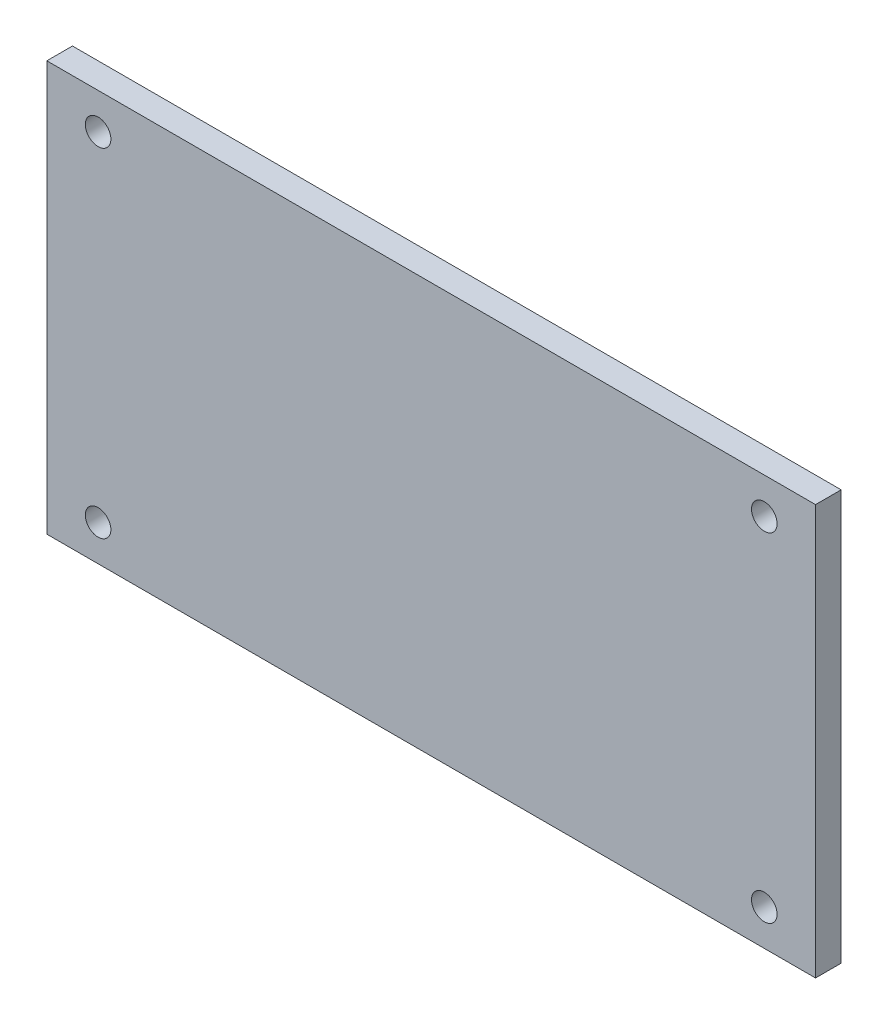
ISO-10303-21;
HEADER;
FILE_DESCRIPTION(('STEP AP214'),'2;1');
FILE_NAME('part.step','',(''),(''),'','','');
FILE_SCHEMA(('AUTOMOTIVE_DESIGN { 1 0 10303 214 1 1 1 1 }'));
ENDSEC;
DATA;
#1=APPLICATION_CONTEXT('core data for automotive mechanical design processes');
#2=APPLICATION_PROTOCOL_DEFINITION('international standard','automotive_design',2000,#1);
#3=PRODUCT_CONTEXT('',#1,'mechanical');
#4=PRODUCT('Part','Part','',(#3));
#5=PRODUCT_RELATED_PRODUCT_CATEGORY('part','',(#4));
#6=PRODUCT_DEFINITION_FORMATION('','',#4);
#7=PRODUCT_DEFINITION_CONTEXT('part definition',#1,'design');
#8=PRODUCT_DEFINITION('design','',#6,#7);
#9=PRODUCT_DEFINITION_SHAPE('','',#8);
#10=(LENGTH_UNIT() NAMED_UNIT(*) SI_UNIT(.MILLI.,.METRE.));
#11=(NAMED_UNIT(*) PLANE_ANGLE_UNIT() SI_UNIT($,.RADIAN.));
#12=(NAMED_UNIT(*) SI_UNIT($,.STERADIAN.) SOLID_ANGLE_UNIT());
#13=UNCERTAINTY_MEASURE_WITH_UNIT(LENGTH_MEASURE(1.E-05),#10,'distance_accuracy_value','');
#14=(GEOMETRIC_REPRESENTATION_CONTEXT(3) GLOBAL_UNCERTAINTY_ASSIGNED_CONTEXT((#13)) GLOBAL_UNIT_ASSIGNED_CONTEXT((#10,
#11,#12)) REPRESENTATION_CONTEXT('',''));
#15=CARTESIAN_POINT('',(0.,0.,0.));
#16=DIRECTION('',(0.,0.,1.));
#17=DIRECTION('',(1.,0.,0.));
#18=AXIS2_PLACEMENT_3D('',#15,#16,#17);
#19=CARTESIAN_POINT('',(0.,0.,5.));
#20=DIRECTION('',(0.,0.,1.));
#21=DIRECTION('',(1.,0.,0.));
#22=AXIS2_PLACEMENT_3D('',#19,#20,#21);
#23=PLANE('',#22);
#24=CARTESIAN_POINT('',(65.,-23.,5.));
#25=DIRECTION('',(0.,0.,1.));
#26=DIRECTION('',(1.,0.,0.));
#27=AXIS2_PLACEMENT_3D('',#24,#25,#26);
#28=CIRCLE('',#27,2.5);
#29=CARTESIAN_POINT('',(67.5,-23.,5.));
#30=VERTEX_POINT('',#29);
#31=EDGE_CURVE('E123',#30,#30,#28,.T.);
#32=ORIENTED_EDGE('',*,*,#31,.F.);
#33=EDGE_LOOP('',(#32));
#34=FACE_BOUND('',#33,.T.);
#35=CARTESIAN_POINT('',(-65.,43.,5.));
#36=DIRECTION('',(0.,0.,1.));
#37=DIRECTION('',(1.,0.,0.));
#38=AXIS2_PLACEMENT_3D('',#35,#36,#37);
#39=CIRCLE('',#38,2.50000000000001);
#40=CARTESIAN_POINT('',(-62.5,43.,5.));
#41=VERTEX_POINT('',#40);
#42=EDGE_CURVE('E102',#41,#41,#39,.T.);
#43=ORIENTED_EDGE('',*,*,#42,.F.);
#44=EDGE_LOOP('',(#43));
#45=FACE_BOUND('',#44,.T.);
#46=DIRECTION('',(0.,1.,0.));
#47=VECTOR('',#46,1.);
#48=CARTESIAN_POINT('',(75.,50.,5.));
#49=LINE('',#48,#47);
#50=CARTESIAN_POINT('',(75.,-30.,5.));
#51=VERTEX_POINT('',#50);
#52=CARTESIAN_POINT('',(75.,50.,5.));
#53=VERTEX_POINT('',#52);
#54=EDGE_CURVE('E87',#51,#53,#49,.T.);
#55=ORIENTED_EDGE('',*,*,#54,.T.);
#56=DIRECTION('',(-1.,0.,0.));
#57=VECTOR('',#56,1.);
#58=CARTESIAN_POINT('',(-75.,50.,5.));
#59=LINE('',#58,#57);
#60=CARTESIAN_POINT('',(-75.,50.,5.));
#61=VERTEX_POINT('',#60);
#62=EDGE_CURVE('E82',#53,#61,#59,.T.);
#63=ORIENTED_EDGE('',*,*,#62,.T.);
#64=DIRECTION('',(0.,-1.,0.));
#65=VECTOR('',#64,1.);
#66=CARTESIAN_POINT('',(-75.,50.,5.));
#67=LINE('',#66,#65);
#68=CARTESIAN_POINT('',(-75.,-30.,5.));
#69=VERTEX_POINT('',#68);
#70=EDGE_CURVE('E85',#61,#69,#67,.T.);
#71=ORIENTED_EDGE('',*,*,#70,.T.);
#72=DIRECTION('',(1.,0.,0.));
#73=VECTOR('',#72,1.);
#74=CARTESIAN_POINT('',(-75.,-30.,5.));
#75=LINE('',#74,#73);
#76=EDGE_CURVE('E52',#69,#51,#75,.T.);
#77=ORIENTED_EDGE('',*,*,#76,.T.);
#78=EDGE_LOOP('',(#55,#63,#71,#77));
#79=FACE_BOUND('',#78,.T.);
#80=CARTESIAN_POINT('',(65.,43.,5.));
#81=DIRECTION('',(0.,0.,1.));
#82=DIRECTION('',(-1.,0.,0.));
#83=AXIS2_PLACEMENT_3D('',#80,#81,#82);
#84=CIRCLE('',#83,2.50000000000001);
#85=CARTESIAN_POINT('',(62.5,43.,5.));
#86=VERTEX_POINT('',#85);
#87=EDGE_CURVE('E117',#86,#86,#84,.T.);
#88=ORIENTED_EDGE('',*,*,#87,.F.);
#89=EDGE_LOOP('',(#88));
#90=FACE_BOUND('',#89,.T.);
#91=CARTESIAN_POINT('',(-65.,-23.,5.));
#92=DIRECTION('',(0.,0.,1.));
#93=DIRECTION('',(-1.,0.,0.));
#94=AXIS2_PLACEMENT_3D('',#91,#92,#93);
#95=CIRCLE('',#94,2.5);
#96=CARTESIAN_POINT('',(-67.5,-23.,5.));
#97=VERTEX_POINT('',#96);
#98=EDGE_CURVE('E129',#97,#97,#95,.T.);
#99=ORIENTED_EDGE('',*,*,#98,.F.);
#100=EDGE_LOOP('',(#99));
#101=FACE_BOUND('',#100,.T.);
#102=ADVANCED_FACE('F35',(#34,#45,#79,#90,#101),#23,.T.);
#103=CARTESIAN_POINT('',(0.,0.,0.));
#104=DIRECTION('',(0.,0.,1.));
#105=DIRECTION('',(1.,0.,0.));
#106=AXIS2_PLACEMENT_3D('',#103,#104,#105);
#107=PLANE('',#106);
#108=DIRECTION('',(0.,1.,0.));
#109=VECTOR('',#108,1.);
#110=CARTESIAN_POINT('',(75.,50.,0.));
#111=LINE('',#110,#109);
#112=CARTESIAN_POINT('',(75.,-30.,0.));
#113=VERTEX_POINT('',#112);
#114=CARTESIAN_POINT('',(75.,50.,0.));
#115=VERTEX_POINT('',#114);
#116=EDGE_CURVE('E99',#113,#115,#111,.T.);
#117=ORIENTED_EDGE('',*,*,#116,.F.);
#118=DIRECTION('',(1.,0.,0.));
#119=VECTOR('',#118,1.);
#120=CARTESIAN_POINT('',(-75.,-30.,0.));
#121=LINE('',#120,#119);
#122=CARTESIAN_POINT('',(-75.,-30.,0.));
#123=VERTEX_POINT('',#122);
#124=EDGE_CURVE('E75',#123,#113,#121,.T.);
#125=ORIENTED_EDGE('',*,*,#124,.F.);
#126=DIRECTION('',(0.,-1.,0.));
#127=VECTOR('',#126,1.);
#128=CARTESIAN_POINT('',(-75.,50.,0.));
#129=LINE('',#128,#127);
#130=CARTESIAN_POINT('',(-75.,50.,0.));
#131=VERTEX_POINT('',#130);
#132=EDGE_CURVE('E69',#131,#123,#129,.T.);
#133=ORIENTED_EDGE('',*,*,#132,.F.);
#134=DIRECTION('',(-1.,0.,0.));
#135=VECTOR('',#134,1.);
#136=CARTESIAN_POINT('',(-75.,50.,0.));
#137=LINE('',#136,#135);
#138=EDGE_CURVE('E91',#115,#131,#137,.T.);
#139=ORIENTED_EDGE('',*,*,#138,.F.);
#140=EDGE_LOOP('',(#117,#125,#133,#139));
#141=FACE_BOUND('',#140,.T.);
#142=CARTESIAN_POINT('',(-65.,43.,0.));
#143=DIRECTION('',(0.,0.,1.));
#144=DIRECTION('',(1.,0.,0.));
#145=AXIS2_PLACEMENT_3D('',#142,#143,#144);
#146=CIRCLE('',#145,2.50000000000001);
#147=CARTESIAN_POINT('',(-62.5,43.,0.));
#148=VERTEX_POINT('',#147);
#149=EDGE_CURVE('E114',#148,#148,#146,.T.);
#150=ORIENTED_EDGE('',*,*,#149,.T.);
#151=EDGE_LOOP('',(#150));
#152=FACE_BOUND('',#151,.T.);
#153=CARTESIAN_POINT('',(65.,43.,0.));
#154=DIRECTION('',(0.,0.,1.));
#155=DIRECTION('',(-1.,0.,0.));
#156=AXIS2_PLACEMENT_3D('',#153,#154,#155);
#157=CIRCLE('',#156,2.50000000000001);
#158=CARTESIAN_POINT('',(62.5,43.,0.));
#159=VERTEX_POINT('',#158);
#160=EDGE_CURVE('E120',#159,#159,#157,.T.);
#161=ORIENTED_EDGE('',*,*,#160,.T.);
#162=EDGE_LOOP('',(#161));
#163=FACE_BOUND('',#162,.T.);
#164=CARTESIAN_POINT('',(65.,-23.,0.));
#165=DIRECTION('',(0.,0.,1.));
#166=DIRECTION('',(1.,0.,0.));
#167=AXIS2_PLACEMENT_3D('',#164,#165,#166);
#168=CIRCLE('',#167,2.5);
#169=CARTESIAN_POINT('',(67.5,-23.,0.));
#170=VERTEX_POINT('',#169);
#171=EDGE_CURVE('E126',#170,#170,#168,.T.);
#172=ORIENTED_EDGE('',*,*,#171,.T.);
#173=EDGE_LOOP('',(#172));
#174=FACE_BOUND('',#173,.T.);
#175=CARTESIAN_POINT('',(-65.,-23.,0.));
#176=DIRECTION('',(0.,0.,1.));
#177=DIRECTION('',(-1.,0.,0.));
#178=AXIS2_PLACEMENT_3D('',#175,#176,#177);
#179=CIRCLE('',#178,2.5);
#180=CARTESIAN_POINT('',(-67.5,-23.,0.));
#181=VERTEX_POINT('',#180);
#182=EDGE_CURVE('E132',#181,#181,#179,.T.);
#183=ORIENTED_EDGE('',*,*,#182,.T.);
#184=EDGE_LOOP('',(#183));
#185=FACE_BOUND('',#184,.T.);
#186=ADVANCED_FACE('F110',(#141,#152,#163,#174,#185),#107,.F.);
#187=CARTESIAN_POINT('',(75.,50.,5.));
#188=DIRECTION('',(-1.,0.,0.));
#189=DIRECTION('',(0.,0.,1.));
#190=AXIS2_PLACEMENT_3D('',#187,#188,#189);
#191=PLANE('',#190);
#192=ORIENTED_EDGE('',*,*,#116,.T.);
#193=DIRECTION('',(0.,0.,-1.));
#194=VECTOR('',#193,1.);
#195=CARTESIAN_POINT('',(75.,50.,5.));
#196=LINE('',#195,#194);
#197=EDGE_CURVE('E11',#53,#115,#196,.T.);
#198=ORIENTED_EDGE('',*,*,#197,.F.);
#199=ORIENTED_EDGE('',*,*,#54,.F.);
#200=DIRECTION('',(0.,0.,-1.));
#201=VECTOR('',#200,1.);
#202=CARTESIAN_POINT('',(75.,-30.,5.));
#203=LINE('',#202,#201);
#204=EDGE_CURVE('E95',#51,#113,#203,.T.);
#205=ORIENTED_EDGE('',*,*,#204,.T.);
#206=EDGE_LOOP('',(#192,#198,#199,#205));
#207=FACE_BOUND('',#206,.T.);
#208=ADVANCED_FACE('F37',(#207),#191,.F.);
#209=CARTESIAN_POINT('',(-75.,50.,5.));
#210=DIRECTION('',(0.,-1.,0.));
#211=DIRECTION('',(0.,0.,-1.));
#212=AXIS2_PLACEMENT_3D('',#209,#210,#211);
#213=PLANE('',#212);
#214=ORIENTED_EDGE('',*,*,#138,.T.);
#215=DIRECTION('',(0.,0.,-1.));
#216=VECTOR('',#215,1.);
#217=CARTESIAN_POINT('',(-75.,50.,5.));
#218=LINE('',#217,#216);
#219=EDGE_CURVE('E44',#61,#131,#218,.T.);
#220=ORIENTED_EDGE('',*,*,#219,.F.);
#221=ORIENTED_EDGE('',*,*,#62,.F.);
#222=ORIENTED_EDGE('',*,*,#197,.T.);
#223=EDGE_LOOP('',(#214,#220,#221,#222));
#224=FACE_BOUND('',#223,.T.);
#225=ADVANCED_FACE('F90',(#224),#213,.F.);
#226=CARTESIAN_POINT('',(-75.,50.,5.));
#227=DIRECTION('',(1.,0.,0.));
#228=DIRECTION('',(0.,0.,-1.));
#229=AXIS2_PLACEMENT_3D('',#226,#227,#228);
#230=PLANE('',#229);
#231=ORIENTED_EDGE('',*,*,#132,.T.);
#232=DIRECTION('',(0.,0.,-1.));
#233=VECTOR('',#232,1.);
#234=CARTESIAN_POINT('',(-75.,-30.,5.));
#235=LINE('',#234,#233);
#236=EDGE_CURVE('E92',#69,#123,#235,.T.);
#237=ORIENTED_EDGE('',*,*,#236,.F.);
#238=ORIENTED_EDGE('',*,*,#70,.F.);
#239=ORIENTED_EDGE('',*,*,#219,.T.);
#240=EDGE_LOOP('',(#231,#237,#238,#239));
#241=FACE_BOUND('',#240,.T.);
#242=ADVANCED_FACE('F93',(#241),#230,.F.);
#243=CARTESIAN_POINT('',(-75.,-30.,5.));
#244=DIRECTION('',(0.,1.,0.));
#245=DIRECTION('',(0.,0.,1.));
#246=AXIS2_PLACEMENT_3D('',#243,#244,#245);
#247=PLANE('',#246);
#248=ORIENTED_EDGE('',*,*,#124,.T.);
#249=ORIENTED_EDGE('',*,*,#204,.F.);
#250=ORIENTED_EDGE('',*,*,#76,.F.);
#251=ORIENTED_EDGE('',*,*,#236,.T.);
#252=EDGE_LOOP('',(#248,#249,#250,#251));
#253=FACE_BOUND('',#252,.T.);
#254=ADVANCED_FACE('F107',(#253),#247,.F.);
#255=CARTESIAN_POINT('',(-65.,43.,5.));
#256=DIRECTION('',(0.,0.,-1.));
#257=DIRECTION('',(-1.,0.,0.));
#258=AXIS2_PLACEMENT_3D('',#255,#256,#257);
#259=CYLINDRICAL_SURFACE('',#258,2.50000000000001);
#260=ORIENTED_EDGE('',*,*,#42,.T.);
#261=EDGE_LOOP('',(#260));
#262=FACE_BOUND('',#261,.T.);
#263=ORIENTED_EDGE('',*,*,#149,.F.);
#264=EDGE_LOOP('',(#263));
#265=FACE_BOUND('',#264,.T.);
#266=ADVANCED_FACE('F151',(#262,#265),#259,.F.);
#267=CARTESIAN_POINT('',(65.,43.,5.));
#268=DIRECTION('',(0.,0.,-1.));
#269=DIRECTION('',(-1.,0.,0.));
#270=AXIS2_PLACEMENT_3D('',#267,#268,#269);
#271=CYLINDRICAL_SURFACE('',#270,2.50000000000001);
#272=ORIENTED_EDGE('',*,*,#87,.T.);
#273=EDGE_LOOP('',(#272));
#274=FACE_BOUND('',#273,.T.);
#275=ORIENTED_EDGE('',*,*,#160,.F.);
#276=EDGE_LOOP('',(#275));
#277=FACE_BOUND('',#276,.T.);
#278=ADVANCED_FACE('F197',(#274,#277),#271,.F.);
#279=CARTESIAN_POINT('',(65.,-23.,5.));
#280=DIRECTION('',(0.,0.,-1.));
#281=DIRECTION('',(-1.,0.,0.));
#282=AXIS2_PLACEMENT_3D('',#279,#280,#281);
#283=CYLINDRICAL_SURFACE('',#282,2.5);
#284=ORIENTED_EDGE('',*,*,#31,.T.);
#285=EDGE_LOOP('',(#284));
#286=FACE_BOUND('',#285,.T.);
#287=ORIENTED_EDGE('',*,*,#171,.F.);
#288=EDGE_LOOP('',(#287));
#289=FACE_BOUND('',#288,.T.);
#290=ADVANCED_FACE('F205',(#286,#289),#283,.F.);
#291=CARTESIAN_POINT('',(-65.,-23.,5.));
#292=DIRECTION('',(0.,0.,-1.));
#293=DIRECTION('',(-1.,0.,0.));
#294=AXIS2_PLACEMENT_3D('',#291,#292,#293);
#295=CYLINDRICAL_SURFACE('',#294,2.5);
#296=ORIENTED_EDGE('',*,*,#98,.T.);
#297=EDGE_LOOP('',(#296));
#298=FACE_BOUND('',#297,.T.);
#299=ORIENTED_EDGE('',*,*,#182,.F.);
#300=EDGE_LOOP('',(#299));
#301=FACE_BOUND('',#300,.T.);
#302=ADVANCED_FACE('F138',(#298,#301),#295,.F.);
#303=CLOSED_SHELL('',(#102,#186,#208,#225,#242,#254,#266,#278,#290,#302));
#304=MANIFOLD_SOLID_BREP('B2',#303);
#305=ADVANCED_BREP_SHAPE_REPRESENTATION('',(#18,#304),#14);
#306=SHAPE_DEFINITION_REPRESENTATION(#9,#305);
ENDSEC;
END-ISO-10303-21;
